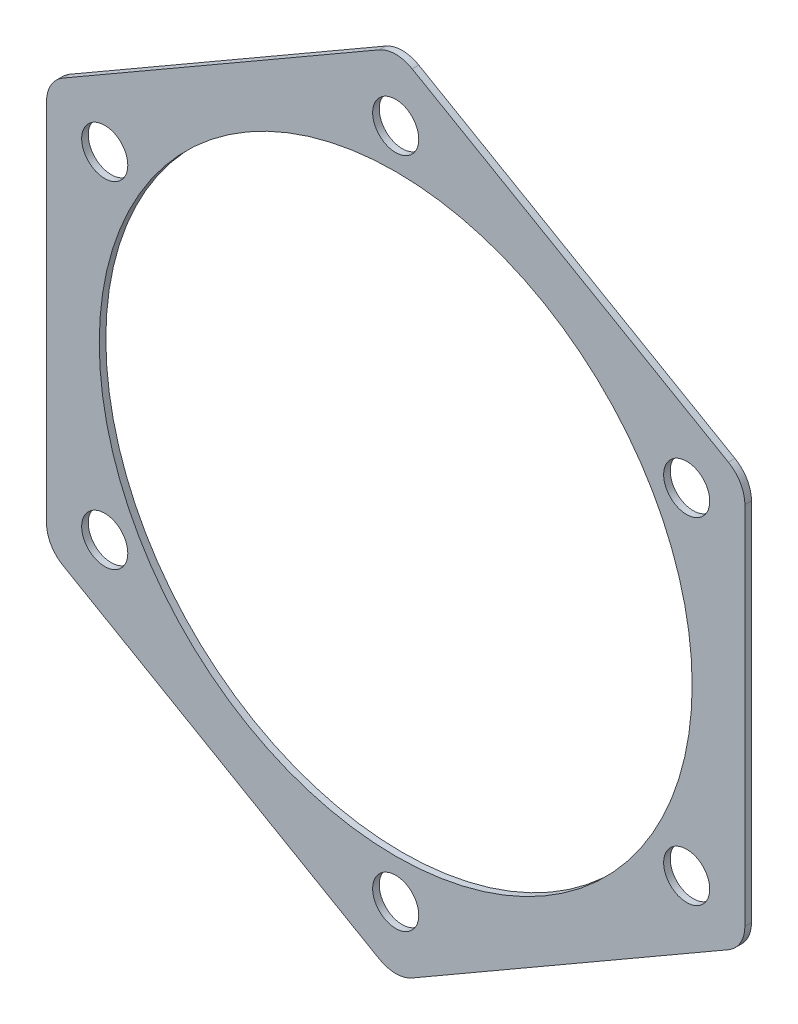
ISO-10303-21;
HEADER;
FILE_DESCRIPTION(('STEP AP214'),'2;1');
FILE_NAME('part.step','',(''),(''),'','','');
FILE_SCHEMA(('AUTOMOTIVE_DESIGN { 1 0 10303 214 1 1 1 1 }'));
ENDSEC;
DATA;
#1=APPLICATION_CONTEXT('core data for automotive mechanical design processes');
#2=APPLICATION_PROTOCOL_DEFINITION('international standard','automotive_design',2000,#1);
#3=PRODUCT_CONTEXT('',#1,'mechanical');
#4=PRODUCT('Part','Part','',(#3));
#5=PRODUCT_RELATED_PRODUCT_CATEGORY('part','',(#4));
#6=PRODUCT_DEFINITION_FORMATION('','',#4);
#7=PRODUCT_DEFINITION_CONTEXT('part definition',#1,'design');
#8=PRODUCT_DEFINITION('design','',#6,#7);
#9=PRODUCT_DEFINITION_SHAPE('','',#8);
#10=(LENGTH_UNIT() NAMED_UNIT(*) SI_UNIT(.MILLI.,.METRE.));
#11=(NAMED_UNIT(*) PLANE_ANGLE_UNIT() SI_UNIT($,.RADIAN.));
#12=(NAMED_UNIT(*) SI_UNIT($,.STERADIAN.) SOLID_ANGLE_UNIT());
#13=UNCERTAINTY_MEASURE_WITH_UNIT(LENGTH_MEASURE(1.E-05),#10,'distance_accuracy_value','');
#14=(GEOMETRIC_REPRESENTATION_CONTEXT(3) GLOBAL_UNCERTAINTY_ASSIGNED_CONTEXT((#13)) GLOBAL_UNIT_ASSIGNED_CONTEXT((#10,
#11,#12)) REPRESENTATION_CONTEXT('',''));
#15=CARTESIAN_POINT('',(0.,0.,0.));
#16=DIRECTION('',(0.,0.,1.));
#17=DIRECTION('',(1.,0.,0.));
#18=AXIS2_PLACEMENT_3D('',#15,#16,#17);
#19=CARTESIAN_POINT('',(-48.,27.712812921102,1.));
#20=DIRECTION('',(0.,0.,-1.));
#21=DIRECTION('',(-1.,0.,0.));
#22=AXIS2_PLACEMENT_3D('',#19,#20,#21);
#23=PLANE('',#22);
#24=CARTESIAN_POINT('',(-48.,27.712812921102,1.));
#25=DIRECTION('',(0.,0.,1.));
#26=DIRECTION('',(-1.,0.,0.));
#27=AXIS2_PLACEMENT_3D('',#24,#25,#26);
#28=CIRCLE('',#27,5.);
#29=CARTESIAN_POINT('',(-50.5,32.0429399400242,1.));
#30=VERTEX_POINT('',#29);
#31=CARTESIAN_POINT('',(-53.,27.712812921102,1.));
#32=VERTEX_POINT('',#31);
#33=EDGE_CURVE('E181',#30,#32,#28,.T.);
#34=ORIENTED_EDGE('',*,*,#33,.T.);
#35=DIRECTION('',(0.,-1.,0.));
#36=VECTOR('',#35,1.);
#37=CARTESIAN_POINT('',(-53.,27.712812921102,1.));
#38=LINE('',#37,#36);
#39=CARTESIAN_POINT('',(-53.,-27.712812921102,1.));
#40=VERTEX_POINT('',#39);
#41=EDGE_CURVE('E109',#32,#40,#38,.T.);
#42=ORIENTED_EDGE('',*,*,#41,.T.);
#43=CARTESIAN_POINT('',(-48.,-27.7128129211021,1.));
#44=DIRECTION('',(0.,0.,1.));
#45=DIRECTION('',(1.,0.,0.));
#46=AXIS2_PLACEMENT_3D('',#43,#44,#45);
#47=CIRCLE('',#46,5.);
#48=CARTESIAN_POINT('',(-50.5,-32.0429399400243,1.));
#49=VERTEX_POINT('',#48);
#50=EDGE_CURVE('E208',#40,#49,#47,.T.);
#51=ORIENTED_EDGE('',*,*,#50,.T.);
#52=DIRECTION('',(0.866025403784439,-0.5,0.));
#53=VECTOR('',#52,1.);
#54=CARTESIAN_POINT('',(-50.5,-32.0429399400243,1.));
#55=LINE('',#54,#53);
#56=CARTESIAN_POINT('',(-2.49999999999998,-59.7557528611263,1.));
#57=VERTEX_POINT('',#56);
#58=EDGE_CURVE('E227',#49,#57,#55,.T.);
#59=ORIENTED_EDGE('',*,*,#58,.T.);
#60=CARTESIAN_POINT('',(0.,-55.4256258422041,1.));
#61=DIRECTION('',(0.,0.,1.));
#62=DIRECTION('',(1.,0.,0.));
#63=AXIS2_PLACEMENT_3D('',#60,#61,#62);
#64=CIRCLE('',#63,5.);
#65=CARTESIAN_POINT('',(2.50000000000006,-59.7557528611263,1.));
#66=VERTEX_POINT('',#65);
#67=EDGE_CURVE('E224',#57,#66,#64,.T.);
#68=ORIENTED_EDGE('',*,*,#67,.T.);
#69=DIRECTION('',(0.866025403784438,0.500000000000001,0.));
#70=VECTOR('',#69,1.);
#71=CARTESIAN_POINT('',(2.50000000000006,-59.7557528611263,1.));
#72=LINE('',#71,#70);
#73=CARTESIAN_POINT('',(50.5,-32.0429399400242,1.));
#74=VERTEX_POINT('',#73);
#75=EDGE_CURVE('E226',#66,#74,#72,.T.);
#76=ORIENTED_EDGE('',*,*,#75,.T.);
#77=CARTESIAN_POINT('',(48.,-27.712812921102,1.));
#78=DIRECTION('',(0.,0.,1.));
#79=DIRECTION('',(1.,0.,0.));
#80=AXIS2_PLACEMENT_3D('',#77,#78,#79);
#81=CIRCLE('',#80,5.00000000000001);
#82=CARTESIAN_POINT('',(53.,-27.712812921102,1.));
#83=VERTEX_POINT('',#82);
#84=EDGE_CURVE('E229',#74,#83,#81,.T.);
#85=ORIENTED_EDGE('',*,*,#84,.T.);
#86=DIRECTION('',(0.,1.,0.));
#87=VECTOR('',#86,1.);
#88=CARTESIAN_POINT('',(53.,-27.712812921102,1.));
#89=LINE('',#88,#87);
#90=CARTESIAN_POINT('',(53.,27.7128129211021,1.));
#91=VERTEX_POINT('',#90);
#92=EDGE_CURVE('E235',#83,#91,#89,.T.);
#93=ORIENTED_EDGE('',*,*,#92,.T.);
#94=CARTESIAN_POINT('',(48.,27.7128129211021,1.));
#95=DIRECTION('',(0.,0.,1.));
#96=DIRECTION('',(1.,0.,0.));
#97=AXIS2_PLACEMENT_3D('',#94,#95,#96);
#98=CIRCLE('',#97,5.);
#99=CARTESIAN_POINT('',(50.5,32.0429399400243,1.));
#100=VERTEX_POINT('',#99);
#101=EDGE_CURVE('E140',#91,#100,#98,.T.);
#102=ORIENTED_EDGE('',*,*,#101,.T.);
#103=DIRECTION('',(-0.866025403784439,0.499999999999999,0.));
#104=VECTOR('',#103,1.);
#105=CARTESIAN_POINT('',(50.5,32.0429399400243,1.));
#106=LINE('',#105,#104);
#107=CARTESIAN_POINT('',(2.50000000000002,59.7557528611263,1.));
#108=VERTEX_POINT('',#107);
#109=EDGE_CURVE('E134',#100,#108,#106,.T.);
#110=ORIENTED_EDGE('',*,*,#109,.T.);
#111=CARTESIAN_POINT('',(0.,55.4256258422041,1.));
#112=DIRECTION('',(0.,0.,1.));
#113=DIRECTION('',(1.,0.,0.));
#114=AXIS2_PLACEMENT_3D('',#111,#112,#113);
#115=CIRCLE('',#114,5.);
#116=CARTESIAN_POINT('',(-2.50000000000002,59.7557528611263,1.));
#117=VERTEX_POINT('',#116);
#118=EDGE_CURVE('E138',#108,#117,#115,.T.);
#119=ORIENTED_EDGE('',*,*,#118,.T.);
#120=DIRECTION('',(-0.866025403784438,-0.5,0.));
#121=VECTOR('',#120,1.);
#122=CARTESIAN_POINT('',(-2.50000000000002,59.7557528611263,1.));
#123=LINE('',#122,#121);
#124=EDGE_CURVE('E54',#117,#30,#123,.T.);
#125=ORIENTED_EDGE('',*,*,#124,.T.);
#126=EDGE_LOOP('',(#34,#42,#51,#59,#68,#76,#85,#93,#102,#110,#119,#125));
#127=FACE_BOUND('',#126,.T.);
#128=CARTESIAN_POINT('',(0.,0.,1.));
#129=DIRECTION('',(0.,0.,1.));
#130=DIRECTION('',(1.,0.,0.));
#131=AXIS2_PLACEMENT_3D('',#128,#129,#130);
#132=CIRCLE('',#131,45.);
#133=CARTESIAN_POINT('',(45.,0.,1.));
#134=VERTEX_POINT('',#133);
#135=EDGE_CURVE('E162',#134,#134,#132,.T.);
#136=ORIENTED_EDGE('',*,*,#135,.F.);
#137=EDGE_LOOP('',(#136));
#138=FACE_BOUND('',#137,.T.);
#139=CARTESIAN_POINT('',(0.,51.,1.));
#140=DIRECTION('',(0.,0.,1.));
#141=DIRECTION('',(1.,0.,0.));
#142=AXIS2_PLACEMENT_3D('',#139,#140,#141);
#143=CIRCLE('',#142,3.5);
#144=CARTESIAN_POINT('',(3.5,51.,1.));
#145=VERTEX_POINT('',#144);
#146=EDGE_CURVE('E329',#145,#145,#143,.T.);
#147=ORIENTED_EDGE('',*,*,#146,.F.);
#148=EDGE_LOOP('',(#147));
#149=FACE_BOUND('',#148,.T.);
#150=CARTESIAN_POINT('',(44.1672955930071,25.5000000000013,1.));
#151=DIRECTION('',(0.,0.,1.));
#152=DIRECTION('',(1.,0.,0.));
#153=AXIS2_PLACEMENT_3D('',#150,#151,#152);
#154=CIRCLE('',#153,3.50000000000046);
#155=CARTESIAN_POINT('',(47.6672955930075,25.5000000000013,1.));
#156=VERTEX_POINT('',#155);
#157=EDGE_CURVE('E323',#156,#156,#154,.T.);
#158=ORIENTED_EDGE('',*,*,#157,.F.);
#159=EDGE_LOOP('',(#158));
#160=FACE_BOUND('',#159,.T.);
#161=CARTESIAN_POINT('',(44.1672955930085,-25.4999999999987,1.));
#162=DIRECTION('',(0.,0.,1.));
#163=DIRECTION('',(1.,0.,0.));
#164=AXIS2_PLACEMENT_3D('',#161,#162,#163);
#165=CIRCLE('',#164,3.50000000000194);
#166=CARTESIAN_POINT('',(47.6672955930105,-25.4999999999987,1.));
#167=VERTEX_POINT('',#166);
#168=EDGE_CURVE('E317',#167,#167,#165,.T.);
#169=ORIENTED_EDGE('',*,*,#168,.F.);
#170=EDGE_LOOP('',(#169));
#171=FACE_BOUND('',#170,.T.);
#172=CARTESIAN_POINT('',(2.88027726587425E-12,-51.,1.));
#173=DIRECTION('',(0.,0.,1.));
#174=DIRECTION('',(1.,0.,0.));
#175=AXIS2_PLACEMENT_3D('',#172,#173,#174);
#176=CIRCLE('',#175,3.5000000000031);
#177=CARTESIAN_POINT('',(3.50000000000598,-51.,1.));
#178=VERTEX_POINT('',#177);
#179=EDGE_CURVE('E311',#178,#178,#176,.T.);
#180=ORIENTED_EDGE('',*,*,#179,.F.);
#181=EDGE_LOOP('',(#180));
#182=FACE_BOUND('',#181,.T.);
#183=CARTESIAN_POINT('',(-44.1672955930042,-25.5000000000013,1.));
#184=DIRECTION('',(0.,0.,1.));
#185=DIRECTION('',(1.,0.,0.));
#186=AXIS2_PLACEMENT_3D('',#183,#184,#185);
#187=CIRCLE('',#186,3.50000000000291);
#188=CARTESIAN_POINT('',(-40.6672955930013,-25.5000000000013,1.));
#189=VERTEX_POINT('',#188);
#190=EDGE_CURVE('E305',#189,#189,#187,.T.);
#191=ORIENTED_EDGE('',*,*,#190,.F.);
#192=EDGE_LOOP('',(#191));
#193=FACE_BOUND('',#192,.T.);
#194=CARTESIAN_POINT('',(-44.1672955930057,25.4999999999987,1.));
#195=DIRECTION('',(0.,0.,1.));
#196=DIRECTION('',(1.,0.,0.));
#197=AXIS2_PLACEMENT_3D('',#194,#195,#196);
#198=CIRCLE('',#197,3.50000000000166);
#199=CARTESIAN_POINT('',(-40.667295593004,25.4999999999987,1.));
#200=VERTEX_POINT('',#199);
#201=EDGE_CURVE('E296',#200,#200,#198,.T.);
#202=ORIENTED_EDGE('',*,*,#201,.F.);
#203=EDGE_LOOP('',(#202));
#204=FACE_BOUND('',#203,.T.);
#205=ADVANCED_FACE('F37',(#127,#138,#149,#160,#171,#182,#193,#204),#23,.F.);
#206=CARTESIAN_POINT('',(-48.,27.712812921102,0.));
#207=DIRECTION('',(0.,0.,-1.));
#208=DIRECTION('',(-1.,0.,0.));
#209=AXIS2_PLACEMENT_3D('',#206,#207,#208);
#210=PLANE('',#209);
#211=CARTESIAN_POINT('',(-44.1672955930042,-25.5000000000013,0.));
#212=DIRECTION('',(0.,0.,1.));
#213=DIRECTION('',(1.,0.,0.));
#214=AXIS2_PLACEMENT_3D('',#211,#212,#213);
#215=CIRCLE('',#214,3.50000000000291);
#216=CARTESIAN_POINT('',(-40.6672955930013,-25.5000000000013,0.));
#217=VERTEX_POINT('',#216);
#218=EDGE_CURVE('E302',#217,#217,#215,.T.);
#219=ORIENTED_EDGE('',*,*,#218,.T.);
#220=EDGE_LOOP('',(#219));
#221=FACE_BOUND('',#220,.T.);
#222=CARTESIAN_POINT('',(44.1672955930085,-25.4999999999987,0.));
#223=DIRECTION('',(0.,0.,1.));
#224=DIRECTION('',(1.,0.,0.));
#225=AXIS2_PLACEMENT_3D('',#222,#223,#224);
#226=CIRCLE('',#225,3.50000000000194);
#227=CARTESIAN_POINT('',(47.6672955930105,-25.4999999999987,0.));
#228=VERTEX_POINT('',#227);
#229=EDGE_CURVE('E314',#228,#228,#226,.T.);
#230=ORIENTED_EDGE('',*,*,#229,.T.);
#231=EDGE_LOOP('',(#230));
#232=FACE_BOUND('',#231,.T.);
#233=CARTESIAN_POINT('',(0.,51.,0.));
#234=DIRECTION('',(0.,0.,1.));
#235=DIRECTION('',(1.,0.,0.));
#236=AXIS2_PLACEMENT_3D('',#233,#234,#235);
#237=CIRCLE('',#236,3.5);
#238=CARTESIAN_POINT('',(3.5,51.,0.));
#239=VERTEX_POINT('',#238);
#240=EDGE_CURVE('E326',#239,#239,#237,.T.);
#241=ORIENTED_EDGE('',*,*,#240,.T.);
#242=EDGE_LOOP('',(#241));
#243=FACE_BOUND('',#242,.T.);
#244=CARTESIAN_POINT('',(-48.,27.712812921102,0.));
#245=DIRECTION('',(0.,0.,1.));
#246=DIRECTION('',(-1.,0.,0.));
#247=AXIS2_PLACEMENT_3D('',#244,#245,#246);
#248=CIRCLE('',#247,5.);
#249=CARTESIAN_POINT('',(-50.5,32.0429399400242,0.));
#250=VERTEX_POINT('',#249);
#251=CARTESIAN_POINT('',(-53.,27.712812921102,0.));
#252=VERTEX_POINT('',#251);
#253=EDGE_CURVE('E158',#250,#252,#248,.T.);
#254=ORIENTED_EDGE('',*,*,#253,.F.);
#255=DIRECTION('',(-0.866025403784438,-0.5,0.));
#256=VECTOR('',#255,1.);
#257=CARTESIAN_POINT('',(-2.50000000000002,59.7557528611263,0.));
#258=LINE('',#257,#256);
#259=CARTESIAN_POINT('',(-2.50000000000002,59.7557528611263,0.));
#260=VERTEX_POINT('',#259);
#261=EDGE_CURVE('E101',#260,#250,#258,.T.);
#262=ORIENTED_EDGE('',*,*,#261,.F.);
#263=CARTESIAN_POINT('',(0.,55.4256258422041,0.));
#264=DIRECTION('',(0.,0.,1.));
#265=DIRECTION('',(1.,0.,0.));
#266=AXIS2_PLACEMENT_3D('',#263,#264,#265);
#267=CIRCLE('',#266,5.);
#268=CARTESIAN_POINT('',(2.50000000000002,59.7557528611263,0.));
#269=VERTEX_POINT('',#268);
#270=EDGE_CURVE('E95',#269,#260,#267,.T.);
#271=ORIENTED_EDGE('',*,*,#270,.F.);
#272=DIRECTION('',(-0.866025403784439,0.499999999999999,0.));
#273=VECTOR('',#272,1.);
#274=CARTESIAN_POINT('',(50.5,32.0429399400243,0.));
#275=LINE('',#274,#273);
#276=CARTESIAN_POINT('',(50.5,32.0429399400243,0.));
#277=VERTEX_POINT('',#276);
#278=EDGE_CURVE('E148',#277,#269,#275,.T.);
#279=ORIENTED_EDGE('',*,*,#278,.F.);
#280=CARTESIAN_POINT('',(48.,27.7128129211021,0.));
#281=DIRECTION('',(0.,0.,1.));
#282=DIRECTION('',(1.,0.,0.));
#283=AXIS2_PLACEMENT_3D('',#280,#281,#282);
#284=CIRCLE('',#283,5.);
#285=CARTESIAN_POINT('',(53.,27.7128129211021,0.));
#286=VERTEX_POINT('',#285);
#287=EDGE_CURVE('E176',#286,#277,#284,.T.);
#288=ORIENTED_EDGE('',*,*,#287,.F.);
#289=DIRECTION('',(0.,1.,0.));
#290=VECTOR('',#289,1.);
#291=CARTESIAN_POINT('',(53.,-27.712812921102,0.));
#292=LINE('',#291,#290);
#293=CARTESIAN_POINT('',(53.,-27.712812921102,0.));
#294=VERTEX_POINT('',#293);
#295=EDGE_CURVE('E174',#294,#286,#292,.T.);
#296=ORIENTED_EDGE('',*,*,#295,.F.);
#297=CARTESIAN_POINT('',(48.,-27.712812921102,0.));
#298=DIRECTION('',(0.,0.,1.));
#299=DIRECTION('',(1.,0.,0.));
#300=AXIS2_PLACEMENT_3D('',#297,#298,#299);
#301=CIRCLE('',#300,5.00000000000001);
#302=CARTESIAN_POINT('',(50.5,-32.0429399400242,0.));
#303=VERTEX_POINT('',#302);
#304=EDGE_CURVE('E172',#303,#294,#301,.T.);
#305=ORIENTED_EDGE('',*,*,#304,.F.);
#306=DIRECTION('',(0.866025403784438,0.500000000000001,0.));
#307=VECTOR('',#306,1.);
#308=CARTESIAN_POINT('',(2.50000000000006,-59.7557528611263,0.));
#309=LINE('',#308,#307);
#310=CARTESIAN_POINT('',(2.50000000000006,-59.7557528611263,0.));
#311=VERTEX_POINT('',#310);
#312=EDGE_CURVE('E170',#311,#303,#309,.T.);
#313=ORIENTED_EDGE('',*,*,#312,.F.);
#314=CARTESIAN_POINT('',(0.,-55.4256258422041,0.));
#315=DIRECTION('',(0.,0.,1.));
#316=DIRECTION('',(1.,0.,0.));
#317=AXIS2_PLACEMENT_3D('',#314,#315,#316);
#318=CIRCLE('',#317,5.);
#319=CARTESIAN_POINT('',(-2.49999999999998,-59.7557528611263,0.));
#320=VERTEX_POINT('',#319);
#321=EDGE_CURVE('E168',#320,#311,#318,.T.);
#322=ORIENTED_EDGE('',*,*,#321,.F.);
#323=DIRECTION('',(0.866025403784439,-0.5,0.));
#324=VECTOR('',#323,1.);
#325=CARTESIAN_POINT('',(-50.5,-32.0429399400243,0.));
#326=LINE('',#325,#324);
#327=CARTESIAN_POINT('',(-50.5,-32.0429399400243,0.));
#328=VERTEX_POINT('',#327);
#329=EDGE_CURVE('E166',#328,#320,#326,.T.);
#330=ORIENTED_EDGE('',*,*,#329,.F.);
#331=CARTESIAN_POINT('',(-48.,-27.7128129211021,0.));
#332=DIRECTION('',(0.,0.,1.));
#333=DIRECTION('',(1.,0.,0.));
#334=AXIS2_PLACEMENT_3D('',#331,#332,#333);
#335=CIRCLE('',#334,5.);
#336=CARTESIAN_POINT('',(-53.,-27.712812921102,0.));
#337=VERTEX_POINT('',#336);
#338=EDGE_CURVE('E164',#337,#328,#335,.T.);
#339=ORIENTED_EDGE('',*,*,#338,.F.);
#340=DIRECTION('',(0.,-1.,0.));
#341=VECTOR('',#340,1.);
#342=CARTESIAN_POINT('',(-53.,27.712812921102,0.));
#343=LINE('',#342,#341);
#344=EDGE_CURVE('E161',#252,#337,#343,.T.);
#345=ORIENTED_EDGE('',*,*,#344,.F.);
#346=EDGE_LOOP('',(#254,#262,#271,#279,#288,#296,#305,#313,#322,#330,#339,#345));
#347=FACE_BOUND('',#346,.T.);
#348=CARTESIAN_POINT('',(0.,0.,0.));
#349=DIRECTION('',(0.,0.,1.));
#350=DIRECTION('',(1.,0.,0.));
#351=AXIS2_PLACEMENT_3D('',#348,#349,#350);
#352=CIRCLE('',#351,45.);
#353=CARTESIAN_POINT('',(45.,0.,0.));
#354=VERTEX_POINT('',#353);
#355=EDGE_CURVE('E332',#354,#354,#352,.T.);
#356=ORIENTED_EDGE('',*,*,#355,.T.);
#357=EDGE_LOOP('',(#356));
#358=FACE_BOUND('',#357,.T.);
#359=CARTESIAN_POINT('',(44.1672955930071,25.5000000000013,0.));
#360=DIRECTION('',(0.,0.,1.));
#361=DIRECTION('',(1.,0.,0.));
#362=AXIS2_PLACEMENT_3D('',#359,#360,#361);
#363=CIRCLE('',#362,3.50000000000046);
#364=CARTESIAN_POINT('',(47.6672955930075,25.5000000000013,0.));
#365=VERTEX_POINT('',#364);
#366=EDGE_CURVE('E320',#365,#365,#363,.T.);
#367=ORIENTED_EDGE('',*,*,#366,.T.);
#368=EDGE_LOOP('',(#367));
#369=FACE_BOUND('',#368,.T.);
#370=CARTESIAN_POINT('',(2.88027726587425E-12,-51.,0.));
#371=DIRECTION('',(0.,0.,1.));
#372=DIRECTION('',(1.,0.,0.));
#373=AXIS2_PLACEMENT_3D('',#370,#371,#372);
#374=CIRCLE('',#373,3.5000000000031);
#375=CARTESIAN_POINT('',(3.50000000000598,-51.,0.));
#376=VERTEX_POINT('',#375);
#377=EDGE_CURVE('E308',#376,#376,#374,.T.);
#378=ORIENTED_EDGE('',*,*,#377,.T.);
#379=EDGE_LOOP('',(#378));
#380=FACE_BOUND('',#379,.T.);
#381=CARTESIAN_POINT('',(-44.1672955930057,25.4999999999987,0.));
#382=DIRECTION('',(0.,0.,1.));
#383=DIRECTION('',(1.,0.,0.));
#384=AXIS2_PLACEMENT_3D('',#381,#382,#383);
#385=CIRCLE('',#384,3.50000000000166);
#386=CARTESIAN_POINT('',(-40.667295593004,25.4999999999987,0.));
#387=VERTEX_POINT('',#386);
#388=EDGE_CURVE('E299',#387,#387,#385,.T.);
#389=ORIENTED_EDGE('',*,*,#388,.T.);
#390=EDGE_LOOP('',(#389));
#391=FACE_BOUND('',#390,.T.);
#392=ADVANCED_FACE('F212',(#221,#232,#243,#347,#358,#369,#380,#391),#210,.T.);
#393=CARTESIAN_POINT('',(-48.,27.712812921102,1.));
#394=DIRECTION('',(0.,0.,-1.));
#395=DIRECTION('',(-1.,0.,0.));
#396=AXIS2_PLACEMENT_3D('',#393,#394,#395);
#397=CYLINDRICAL_SURFACE('',#396,5.);
#398=ORIENTED_EDGE('',*,*,#253,.T.);
#399=DIRECTION('',(0.,0.,-1.));
#400=VECTOR('',#399,1.);
#401=CARTESIAN_POINT('',(-53.,27.712812921102,1.));
#402=LINE('',#401,#400);
#403=EDGE_CURVE('E11',#32,#252,#402,.T.);
#404=ORIENTED_EDGE('',*,*,#403,.F.);
#405=ORIENTED_EDGE('',*,*,#33,.F.);
#406=DIRECTION('',(0.,0.,-1.));
#407=VECTOR('',#406,1.);
#408=CARTESIAN_POINT('',(-50.5,32.0429399400242,1.));
#409=LINE('',#408,#407);
#410=EDGE_CURVE('E154',#30,#250,#409,.T.);
#411=ORIENTED_EDGE('',*,*,#410,.T.);
#412=EDGE_LOOP('',(#398,#404,#405,#411));
#413=FACE_BOUND('',#412,.T.);
#414=ADVANCED_FACE('F39',(#413),#397,.T.);
#415=CARTESIAN_POINT('',(-53.,27.712812921102,1.));
#416=DIRECTION('',(1.,0.,0.));
#417=DIRECTION('',(0.,1.,0.));
#418=AXIS2_PLACEMENT_3D('',#415,#416,#417);
#419=PLANE('',#418);
#420=ORIENTED_EDGE('',*,*,#344,.T.);
#421=DIRECTION('',(0.,0.,-1.));
#422=VECTOR('',#421,1.);
#423=CARTESIAN_POINT('',(-53.,-27.712812921102,1.));
#424=LINE('',#423,#422);
#425=EDGE_CURVE('E46',#40,#337,#424,.T.);
#426=ORIENTED_EDGE('',*,*,#425,.F.);
#427=ORIENTED_EDGE('',*,*,#41,.F.);
#428=ORIENTED_EDGE('',*,*,#403,.T.);
#429=EDGE_LOOP('',(#420,#426,#427,#428));
#430=FACE_BOUND('',#429,.T.);
#431=ADVANCED_FACE('F481',(#430),#419,.F.);
#432=CARTESIAN_POINT('',(-48.,-27.7128129211021,1.));
#433=DIRECTION('',(0.,0.,-1.));
#434=DIRECTION('',(-1.,0.,0.));
#435=AXIS2_PLACEMENT_3D('',#432,#433,#434);
#436=CYLINDRICAL_SURFACE('',#435,5.);
#437=ORIENTED_EDGE('',*,*,#338,.T.);
#438=DIRECTION('',(0.,0.,-1.));
#439=VECTOR('',#438,1.);
#440=CARTESIAN_POINT('',(-50.5,-32.0429399400243,1.));
#441=LINE('',#440,#439);
#442=EDGE_CURVE('E200',#49,#328,#441,.T.);
#443=ORIENTED_EDGE('',*,*,#442,.F.);
#444=ORIENTED_EDGE('',*,*,#50,.F.);
#445=ORIENTED_EDGE('',*,*,#425,.T.);
#446=EDGE_LOOP('',(#437,#443,#444,#445));
#447=FACE_BOUND('',#446,.T.);
#448=ADVANCED_FACE('F206',(#447),#436,.T.);
#449=CARTESIAN_POINT('',(-50.5,-32.0429399400243,1.));
#450=DIRECTION('',(0.5,0.866025403784439,0.));
#451=DIRECTION('',(-0.866025403784439,0.5,0.));
#452=AXIS2_PLACEMENT_3D('',#449,#450,#451);
#453=PLANE('',#452);
#454=ORIENTED_EDGE('',*,*,#329,.T.);
#455=DIRECTION('',(0.,0.,-1.));
#456=VECTOR('',#455,1.);
#457=CARTESIAN_POINT('',(-2.49999999999998,-59.7557528611263,1.));
#458=LINE('',#457,#456);
#459=EDGE_CURVE('E197',#57,#320,#458,.T.);
#460=ORIENTED_EDGE('',*,*,#459,.F.);
#461=ORIENTED_EDGE('',*,*,#58,.F.);
#462=ORIENTED_EDGE('',*,*,#442,.T.);
#463=EDGE_LOOP('',(#454,#460,#461,#462));
#464=FACE_BOUND('',#463,.T.);
#465=ADVANCED_FACE('F218',(#464),#453,.F.);
#466=CARTESIAN_POINT('',(0.,-55.4256258422041,1.));
#467=DIRECTION('',(0.,0.,-1.));
#468=DIRECTION('',(-1.,0.,0.));
#469=AXIS2_PLACEMENT_3D('',#466,#467,#468);
#470=CYLINDRICAL_SURFACE('',#469,5.);
#471=ORIENTED_EDGE('',*,*,#321,.T.);
#472=DIRECTION('',(0.,0.,-1.));
#473=VECTOR('',#472,1.);
#474=CARTESIAN_POINT('',(2.50000000000006,-59.7557528611263,1.));
#475=LINE('',#474,#473);
#476=EDGE_CURVE('E194',#66,#311,#475,.T.);
#477=ORIENTED_EDGE('',*,*,#476,.F.);
#478=ORIENTED_EDGE('',*,*,#67,.F.);
#479=ORIENTED_EDGE('',*,*,#459,.T.);
#480=EDGE_LOOP('',(#471,#477,#478,#479));
#481=FACE_BOUND('',#480,.T.);
#482=ADVANCED_FACE('F222',(#481),#470,.T.);
#483=CARTESIAN_POINT('',(2.50000000000006,-59.7557528611263,1.));
#484=DIRECTION('',(-0.500000000000001,0.866025403784438,0.));
#485=DIRECTION('',(-0.866025403784438,-0.500000000000001,0.));
#486=AXIS2_PLACEMENT_3D('',#483,#484,#485);
#487=PLANE('',#486);
#488=ORIENTED_EDGE('',*,*,#312,.T.);
#489=DIRECTION('',(0.,0.,-1.));
#490=VECTOR('',#489,1.);
#491=CARTESIAN_POINT('',(50.5,-32.0429399400242,1.));
#492=LINE('',#491,#490);
#493=EDGE_CURVE('E191',#74,#303,#492,.T.);
#494=ORIENTED_EDGE('',*,*,#493,.F.);
#495=ORIENTED_EDGE('',*,*,#75,.F.);
#496=ORIENTED_EDGE('',*,*,#476,.T.);
#497=EDGE_LOOP('',(#488,#494,#495,#496));
#498=FACE_BOUND('',#497,.T.);
#499=ADVANCED_FACE('F442',(#498),#487,.F.);
#500=CARTESIAN_POINT('',(48.,-27.712812921102,1.));
#501=DIRECTION('',(0.,0.,-1.));
#502=DIRECTION('',(-1.,0.,0.));
#503=AXIS2_PLACEMENT_3D('',#500,#501,#502);
#504=CYLINDRICAL_SURFACE('',#503,5.00000000000001);
#505=ORIENTED_EDGE('',*,*,#304,.T.);
#506=DIRECTION('',(0.,0.,-1.));
#507=VECTOR('',#506,1.);
#508=CARTESIAN_POINT('',(53.,-27.712812921102,1.));
#509=LINE('',#508,#507);
#510=EDGE_CURVE('E188',#83,#294,#509,.T.);
#511=ORIENTED_EDGE('',*,*,#510,.F.);
#512=ORIENTED_EDGE('',*,*,#84,.F.);
#513=ORIENTED_EDGE('',*,*,#493,.T.);
#514=EDGE_LOOP('',(#505,#511,#512,#513));
#515=FACE_BOUND('',#514,.T.);
#516=ADVANCED_FACE('F432',(#515),#504,.T.);
#517=CARTESIAN_POINT('',(53.,-27.712812921102,1.));
#518=DIRECTION('',(-1.,0.,0.));
#519=DIRECTION('',(0.,-1.,0.));
#520=AXIS2_PLACEMENT_3D('',#517,#518,#519);
#521=PLANE('',#520);
#522=ORIENTED_EDGE('',*,*,#295,.T.);
#523=DIRECTION('',(0.,0.,-1.));
#524=VECTOR('',#523,1.);
#525=CARTESIAN_POINT('',(53.,27.7128129211021,1.));
#526=LINE('',#525,#524);
#527=EDGE_CURVE('E185',#91,#286,#526,.T.);
#528=ORIENTED_EDGE('',*,*,#527,.F.);
#529=ORIENTED_EDGE('',*,*,#92,.F.);
#530=ORIENTED_EDGE('',*,*,#510,.T.);
#531=EDGE_LOOP('',(#522,#528,#529,#530));
#532=FACE_BOUND('',#531,.T.);
#533=ADVANCED_FACE('F241',(#532),#521,.F.);
#534=CARTESIAN_POINT('',(48.,27.7128129211021,1.));
#535=DIRECTION('',(0.,0.,-1.));
#536=DIRECTION('',(-1.,0.,0.));
#537=AXIS2_PLACEMENT_3D('',#534,#535,#536);
#538=CYLINDRICAL_SURFACE('',#537,5.);
#539=ORIENTED_EDGE('',*,*,#287,.T.);
#540=DIRECTION('',(0.,0.,-1.));
#541=VECTOR('',#540,1.);
#542=CARTESIAN_POINT('',(50.5,32.0429399400243,1.));
#543=LINE('',#542,#541);
#544=EDGE_CURVE('E149',#100,#277,#543,.T.);
#545=ORIENTED_EDGE('',*,*,#544,.F.);
#546=ORIENTED_EDGE('',*,*,#101,.F.);
#547=ORIENTED_EDGE('',*,*,#527,.T.);
#548=EDGE_LOOP('',(#539,#545,#546,#547));
#549=FACE_BOUND('',#548,.T.);
#550=ADVANCED_FACE('F245',(#549),#538,.T.);
#551=CARTESIAN_POINT('',(50.5,32.0429399400243,1.));
#552=DIRECTION('',(-0.499999999999999,-0.866025403784439,0.));
#553=DIRECTION('',(0.866025403784439,-0.499999999999999,0.));
#554=AXIS2_PLACEMENT_3D('',#551,#552,#553);
#555=PLANE('',#554);
#556=ORIENTED_EDGE('',*,*,#278,.T.);
#557=DIRECTION('',(0.,0.,-1.));
#558=VECTOR('',#557,1.);
#559=CARTESIAN_POINT('',(2.50000000000002,59.7557528611263,1.));
#560=LINE('',#559,#558);
#561=EDGE_CURVE('E145',#108,#269,#560,.T.);
#562=ORIENTED_EDGE('',*,*,#561,.F.);
#563=ORIENTED_EDGE('',*,*,#109,.F.);
#564=ORIENTED_EDGE('',*,*,#544,.T.);
#565=EDGE_LOOP('',(#556,#562,#563,#564));
#566=FACE_BOUND('',#565,.T.);
#567=ADVANCED_FACE('F146',(#566),#555,.F.);
#568=CARTESIAN_POINT('',(0.,55.4256258422041,1.));
#569=DIRECTION('',(0.,0.,-1.));
#570=DIRECTION('',(-1.,0.,0.));
#571=AXIS2_PLACEMENT_3D('',#568,#569,#570);
#572=CYLINDRICAL_SURFACE('',#571,5.);
#573=ORIENTED_EDGE('',*,*,#270,.T.);
#574=DIRECTION('',(0.,0.,-1.));
#575=VECTOR('',#574,1.);
#576=CARTESIAN_POINT('',(-2.50000000000002,59.7557528611263,1.));
#577=LINE('',#576,#575);
#578=EDGE_CURVE('E150',#117,#260,#577,.T.);
#579=ORIENTED_EDGE('',*,*,#578,.F.);
#580=ORIENTED_EDGE('',*,*,#118,.F.);
#581=ORIENTED_EDGE('',*,*,#561,.T.);
#582=EDGE_LOOP('',(#573,#579,#580,#581));
#583=FACE_BOUND('',#582,.T.);
#584=ADVANCED_FACE('F152',(#583),#572,.T.);
#585=CARTESIAN_POINT('',(-2.50000000000002,59.7557528611263,1.));
#586=DIRECTION('',(0.5,-0.866025403784438,0.));
#587=DIRECTION('',(0.866025403784438,0.5,0.));
#588=AXIS2_PLACEMENT_3D('',#585,#586,#587);
#589=PLANE('',#588);
#590=ORIENTED_EDGE('',*,*,#261,.T.);
#591=ORIENTED_EDGE('',*,*,#410,.F.);
#592=ORIENTED_EDGE('',*,*,#124,.F.);
#593=ORIENTED_EDGE('',*,*,#578,.T.);
#594=EDGE_LOOP('',(#590,#591,#592,#593));
#595=FACE_BOUND('',#594,.T.);
#596=ADVANCED_FACE('F249',(#595),#589,.F.);
#597=CARTESIAN_POINT('',(0.,0.,1.));
#598=DIRECTION('',(0.,0.,-1.));
#599=DIRECTION('',(-1.,0.,0.));
#600=AXIS2_PLACEMENT_3D('',#597,#598,#599);
#601=CYLINDRICAL_SURFACE('',#600,45.);
#602=ORIENTED_EDGE('',*,*,#135,.T.);
#603=EDGE_LOOP('',(#602));
#604=FACE_BOUND('',#603,.T.);
#605=ORIENTED_EDGE('',*,*,#355,.F.);
#606=EDGE_LOOP('',(#605));
#607=FACE_BOUND('',#606,.T.);
#608=ADVANCED_FACE('F251',(#604,#607),#601,.F.);
#609=CARTESIAN_POINT('',(0.,51.,1.));
#610=DIRECTION('',(0.,0.,-1.));
#611=DIRECTION('',(-1.,0.,0.));
#612=AXIS2_PLACEMENT_3D('',#609,#610,#611);
#613=CYLINDRICAL_SURFACE('',#612,3.5);
#614=ORIENTED_EDGE('',*,*,#146,.T.);
#615=EDGE_LOOP('',(#614));
#616=FACE_BOUND('',#615,.T.);
#617=ORIENTED_EDGE('',*,*,#240,.F.);
#618=EDGE_LOOP('',(#617));
#619=FACE_BOUND('',#618,.T.);
#620=ADVANCED_FACE('F257',(#616,#619),#613,.F.);
#621=CARTESIAN_POINT('',(44.1672955930071,25.5000000000013,1.));
#622=DIRECTION('',(0.,0.,-1.));
#623=DIRECTION('',(-1.,0.,0.));
#624=AXIS2_PLACEMENT_3D('',#621,#622,#623);
#625=CYLINDRICAL_SURFACE('',#624,3.50000000000046);
#626=ORIENTED_EDGE('',*,*,#157,.T.);
#627=EDGE_LOOP('',(#626));
#628=FACE_BOUND('',#627,.T.);
#629=ORIENTED_EDGE('',*,*,#366,.F.);
#630=EDGE_LOOP('',(#629));
#631=FACE_BOUND('',#630,.T.);
#632=ADVANCED_FACE('F271',(#628,#631),#625,.F.);
#633=CARTESIAN_POINT('',(44.1672955930085,-25.4999999999987,1.));
#634=DIRECTION('',(0.,0.,-1.));
#635=DIRECTION('',(-1.,0.,0.));
#636=AXIS2_PLACEMENT_3D('',#633,#634,#635);
#637=CYLINDRICAL_SURFACE('',#636,3.50000000000194);
#638=ORIENTED_EDGE('',*,*,#168,.T.);
#639=EDGE_LOOP('',(#638));
#640=FACE_BOUND('',#639,.T.);
#641=ORIENTED_EDGE('',*,*,#229,.F.);
#642=EDGE_LOOP('',(#641));
#643=FACE_BOUND('',#642,.T.);
#644=ADVANCED_FACE('F275',(#640,#643),#637,.F.);
#645=CARTESIAN_POINT('',(2.88027726587425E-12,-51.,1.));
#646=DIRECTION('',(0.,0.,-1.));
#647=DIRECTION('',(-1.,0.,0.));
#648=AXIS2_PLACEMENT_3D('',#645,#646,#647);
#649=CYLINDRICAL_SURFACE('',#648,3.5000000000031);
#650=ORIENTED_EDGE('',*,*,#179,.T.);
#651=EDGE_LOOP('',(#650));
#652=FACE_BOUND('',#651,.T.);
#653=ORIENTED_EDGE('',*,*,#377,.F.);
#654=EDGE_LOOP('',(#653));
#655=FACE_BOUND('',#654,.T.);
#656=ADVANCED_FACE('F279',(#652,#655),#649,.F.);
#657=CARTESIAN_POINT('',(-44.1672955930042,-25.5000000000013,1.));
#658=DIRECTION('',(0.,0.,-1.));
#659=DIRECTION('',(-1.,0.,0.));
#660=AXIS2_PLACEMENT_3D('',#657,#658,#659);
#661=CYLINDRICAL_SURFACE('',#660,3.50000000000291);
#662=ORIENTED_EDGE('',*,*,#190,.T.);
#663=EDGE_LOOP('',(#662));
#664=FACE_BOUND('',#663,.T.);
#665=ORIENTED_EDGE('',*,*,#218,.F.);
#666=EDGE_LOOP('',(#665));
#667=FACE_BOUND('',#666,.T.);
#668=ADVANCED_FACE('F283',(#664,#667),#661,.F.);
#669=CARTESIAN_POINT('',(-44.1672955930057,25.4999999999987,1.));
#670=DIRECTION('',(0.,0.,-1.));
#671=DIRECTION('',(-1.,0.,0.));
#672=AXIS2_PLACEMENT_3D('',#669,#670,#671);
#673=CYLINDRICAL_SURFACE('',#672,3.50000000000166);
#674=ORIENTED_EDGE('',*,*,#201,.T.);
#675=EDGE_LOOP('',(#674));
#676=FACE_BOUND('',#675,.T.);
#677=ORIENTED_EDGE('',*,*,#388,.F.);
#678=EDGE_LOOP('',(#677));
#679=FACE_BOUND('',#678,.T.);
#680=ADVANCED_FACE('F287',(#676,#679),#673,.F.);
#681=CLOSED_SHELL('',(#205,#392,#414,#431,#448,#465,#482,#499,#516,#533,#550,#567,#584,#596,
#608,#620,#632,#644,#656,#668,#680));
#682=MANIFOLD_SOLID_BREP('B2',#681);
#683=ADVANCED_BREP_SHAPE_REPRESENTATION('',(#18,#682),#14);
#684=SHAPE_DEFINITION_REPRESENTATION(#9,#683);
ENDSEC;
END-ISO-10303-21;
